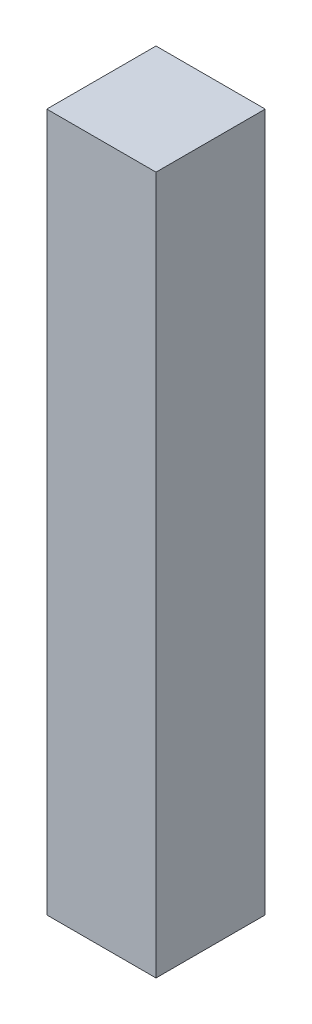
ISO-10303-21;
HEADER;
FILE_DESCRIPTION(('STEP AP214'),'2;1');
FILE_NAME('part.step','',(''),(''),'','','');
FILE_SCHEMA(('AUTOMOTIVE_DESIGN { 1 0 10303 214 1 1 1 1 }'));
ENDSEC;
DATA;
#1=APPLICATION_CONTEXT('core data for automotive mechanical design processes');
#2=APPLICATION_PROTOCOL_DEFINITION('international standard','automotive_design',2000,#1);
#3=PRODUCT_CONTEXT('',#1,'mechanical');
#4=PRODUCT('Part','Part','',(#3));
#5=PRODUCT_RELATED_PRODUCT_CATEGORY('part','',(#4));
#6=PRODUCT_DEFINITION_FORMATION('','',#4);
#7=PRODUCT_DEFINITION_CONTEXT('part definition',#1,'design');
#8=PRODUCT_DEFINITION('design','',#6,#7);
#9=PRODUCT_DEFINITION_SHAPE('','',#8);
#10=(LENGTH_UNIT() NAMED_UNIT(*) SI_UNIT(.MILLI.,.METRE.));
#11=(NAMED_UNIT(*) PLANE_ANGLE_UNIT() SI_UNIT($,.RADIAN.));
#12=(NAMED_UNIT(*) SI_UNIT($,.STERADIAN.) SOLID_ANGLE_UNIT());
#13=UNCERTAINTY_MEASURE_WITH_UNIT(LENGTH_MEASURE(1.E-05),#10,'distance_accuracy_value','');
#14=(GEOMETRIC_REPRESENTATION_CONTEXT(3) GLOBAL_UNCERTAINTY_ASSIGNED_CONTEXT((#13)) GLOBAL_UNIT_ASSIGNED_CONTEXT((#10,
#11,#12)) REPRESENTATION_CONTEXT('',''));
#15=CARTESIAN_POINT('',(0.,0.,0.));
#16=DIRECTION('',(0.,0.,1.));
#17=DIRECTION('',(1.,0.,0.));
#18=AXIS2_PLACEMENT_3D('',#15,#16,#17);
#19=CARTESIAN_POINT('',(0.,115.,0.));
#20=DIRECTION('',(1.,0.,0.));
#21=DIRECTION('',(0.,0.,-1.));
#22=AXIS2_PLACEMENT_3D('',#19,#20,#21);
#23=PLANE('',#22);
#24=DIRECTION('',(0.,0.,1.));
#25=VECTOR('',#24,1.);
#26=CARTESIAN_POINT('',(0.,0.,0.));
#27=LINE('',#26,#25);
#28=CARTESIAN_POINT('',(0.,0.,-18.));
#29=VERTEX_POINT('',#28);
#30=CARTESIAN_POINT('',(0.,0.,0.));
#31=VERTEX_POINT('',#30);
#32=EDGE_CURVE('E107',#29,#31,#27,.T.);
#33=ORIENTED_EDGE('',*,*,#32,.T.);
#34=DIRECTION('',(0.,-1.,0.));
#35=VECTOR('',#34,1.);
#36=CARTESIAN_POINT('',(0.,115.,0.));
#37=LINE('',#36,#35);
#38=CARTESIAN_POINT('',(0.,115.,0.));
#39=VERTEX_POINT('',#38);
#40=EDGE_CURVE('E11',#39,#31,#37,.T.);
#41=ORIENTED_EDGE('',*,*,#40,.F.);
#42=DIRECTION('',(0.,0.,1.));
#43=VECTOR('',#42,1.);
#44=CARTESIAN_POINT('',(0.,115.,0.));
#45=LINE('',#44,#43);
#46=CARTESIAN_POINT('',(0.,115.,-18.));
#47=VERTEX_POINT('',#46);
#48=EDGE_CURVE('E91',#47,#39,#45,.T.);
#49=ORIENTED_EDGE('',*,*,#48,.F.);
#50=DIRECTION('',(0.,-1.,0.));
#51=VECTOR('',#50,1.);
#52=CARTESIAN_POINT('',(0.,115.,-18.));
#53=LINE('',#52,#51);
#54=EDGE_CURVE('E103',#47,#29,#53,.T.);
#55=ORIENTED_EDGE('',*,*,#54,.T.);
#56=EDGE_LOOP('',(#33,#41,#49,#55));
#57=FACE_BOUND('',#56,.T.);
#58=ADVANCED_FACE('F39',(#57),#23,.F.);
#59=CARTESIAN_POINT('',(0.,115.,0.));
#60=DIRECTION('',(0.,0.,-1.));
#61=DIRECTION('',(-1.,0.,0.));
#62=AXIS2_PLACEMENT_3D('',#59,#60,#61);
#63=PLANE('',#62);
#64=DIRECTION('',(1.,0.,0.));
#65=VECTOR('',#64,1.);
#66=CARTESIAN_POINT('',(0.,0.,0.));
#67=LINE('',#66,#65);
#68=CARTESIAN_POINT('',(18.,0.,0.));
#69=VERTEX_POINT('',#68);
#70=EDGE_CURVE('E96',#31,#69,#67,.T.);
#71=ORIENTED_EDGE('',*,*,#70,.T.);
#72=DIRECTION('',(0.,-1.,0.));
#73=VECTOR('',#72,1.);
#74=CARTESIAN_POINT('',(18.,115.,0.));
#75=LINE('',#74,#73);
#76=CARTESIAN_POINT('',(18.,115.,0.));
#77=VERTEX_POINT('',#76);
#78=EDGE_CURVE('E48',#77,#69,#75,.T.);
#79=ORIENTED_EDGE('',*,*,#78,.F.);
#80=DIRECTION('',(1.,0.,0.));
#81=VECTOR('',#80,1.);
#82=CARTESIAN_POINT('',(0.,115.,0.));
#83=LINE('',#82,#81);
#84=EDGE_CURVE('E86',#39,#77,#83,.T.);
#85=ORIENTED_EDGE('',*,*,#84,.F.);
#86=ORIENTED_EDGE('',*,*,#40,.T.);
#87=EDGE_LOOP('',(#71,#79,#85,#86));
#88=FACE_BOUND('',#87,.T.);
#89=ADVANCED_FACE('F95',(#88),#63,.F.);
#90=CARTESIAN_POINT('',(18.,115.,0.));
#91=DIRECTION('',(-1.,0.,0.));
#92=DIRECTION('',(0.,0.,1.));
#93=AXIS2_PLACEMENT_3D('',#90,#91,#92);
#94=PLANE('',#93);
#95=DIRECTION('',(0.,0.,-1.));
#96=VECTOR('',#95,1.);
#97=CARTESIAN_POINT('',(18.,0.,0.));
#98=LINE('',#97,#96);
#99=CARTESIAN_POINT('',(18.,0.,-18.));
#100=VERTEX_POINT('',#99);
#101=EDGE_CURVE('E73',#69,#100,#98,.T.);
#102=ORIENTED_EDGE('',*,*,#101,.T.);
#103=DIRECTION('',(0.,-1.,0.));
#104=VECTOR('',#103,1.);
#105=CARTESIAN_POINT('',(18.,115.,-18.));
#106=LINE('',#105,#104);
#107=CARTESIAN_POINT('',(18.,115.,-18.));
#108=VERTEX_POINT('',#107);
#109=EDGE_CURVE('E98',#108,#100,#106,.T.);
#110=ORIENTED_EDGE('',*,*,#109,.F.);
#111=DIRECTION('',(0.,0.,-1.));
#112=VECTOR('',#111,1.);
#113=CARTESIAN_POINT('',(18.,115.,0.));
#114=LINE('',#113,#112);
#115=EDGE_CURVE('E89',#77,#108,#114,.T.);
#116=ORIENTED_EDGE('',*,*,#115,.F.);
#117=ORIENTED_EDGE('',*,*,#78,.T.);
#118=EDGE_LOOP('',(#102,#110,#116,#117));
#119=FACE_BOUND('',#118,.T.);
#120=ADVANCED_FACE('F99',(#119),#94,.F.);
#121=CARTESIAN_POINT('',(0.,115.,-18.));
#122=DIRECTION('',(0.,0.,1.));
#123=DIRECTION('',(1.,0.,0.));
#124=AXIS2_PLACEMENT_3D('',#121,#122,#123);
#125=PLANE('',#124);
#126=DIRECTION('',(-1.,0.,0.));
#127=VECTOR('',#126,1.);
#128=CARTESIAN_POINT('',(0.,0.,-18.));
#129=LINE('',#128,#127);
#130=EDGE_CURVE('E79',#100,#29,#129,.T.);
#131=ORIENTED_EDGE('',*,*,#130,.T.);
#132=ORIENTED_EDGE('',*,*,#54,.F.);
#133=DIRECTION('',(-1.,0.,0.));
#134=VECTOR('',#133,1.);
#135=CARTESIAN_POINT('',(0.,115.,-18.));
#136=LINE('',#135,#134);
#137=EDGE_CURVE('E56',#108,#47,#136,.T.);
#138=ORIENTED_EDGE('',*,*,#137,.F.);
#139=ORIENTED_EDGE('',*,*,#109,.T.);
#140=EDGE_LOOP('',(#131,#132,#138,#139));
#141=FACE_BOUND('',#140,.T.);
#142=ADVANCED_FACE('F120',(#141),#125,.F.);
#143=CARTESIAN_POINT('',(0.,115.,0.));
#144=DIRECTION('',(0.,-1.,0.));
#145=DIRECTION('',(0.,0.,-1.));
#146=AXIS2_PLACEMENT_3D('',#143,#144,#145);
#147=PLANE('',#146);
#148=ORIENTED_EDGE('',*,*,#48,.T.);
#149=ORIENTED_EDGE('',*,*,#84,.T.);
#150=ORIENTED_EDGE('',*,*,#115,.T.);
#151=ORIENTED_EDGE('',*,*,#137,.T.);
#152=EDGE_LOOP('',(#148,#149,#150,#151));
#153=FACE_BOUND('',#152,.T.);
#154=ADVANCED_FACE('F87',(#153),#147,.F.);
#155=CARTESIAN_POINT('',(0.,0.,0.));
#156=DIRECTION('',(0.,-1.,0.));
#157=DIRECTION('',(0.,0.,-1.));
#158=AXIS2_PLACEMENT_3D('',#155,#156,#157);
#159=PLANE('',#158);
#160=ORIENTED_EDGE('',*,*,#32,.F.);
#161=ORIENTED_EDGE('',*,*,#130,.F.);
#162=ORIENTED_EDGE('',*,*,#101,.F.);
#163=ORIENTED_EDGE('',*,*,#70,.F.);
#164=EDGE_LOOP('',(#160,#161,#162,#163));
#165=FACE_BOUND('',#164,.T.);
#166=ADVANCED_FACE('F123',(#165),#159,.T.);
#167=CLOSED_SHELL('',(#58,#89,#120,#142,#154,#166));
#168=MANIFOLD_SOLID_BREP('B2',#167);
#169=ADVANCED_BREP_SHAPE_REPRESENTATION('',(#18,#168),#14);
#170=SHAPE_DEFINITION_REPRESENTATION(#9,#169);
ENDSEC;
END-ISO-10303-21;
